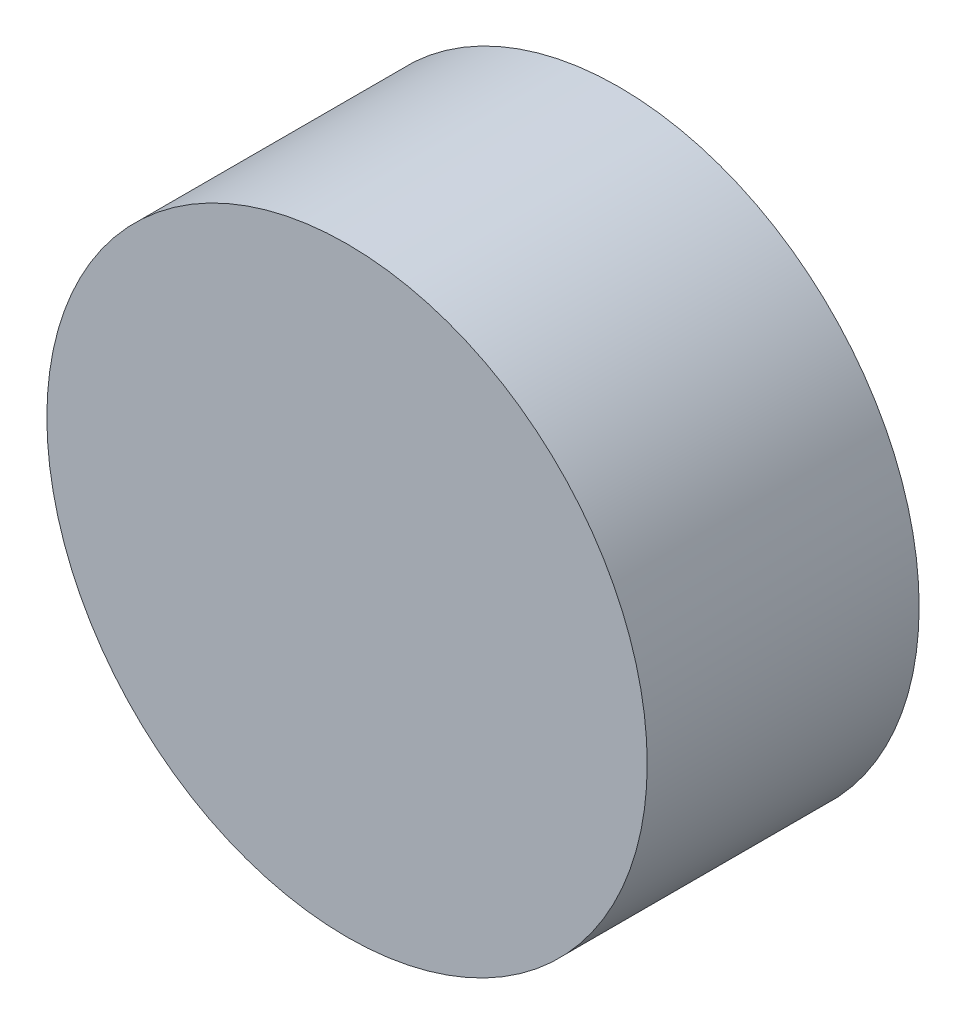
ISO-10303-21;
HEADER;
FILE_DESCRIPTION(('STEP AP214'),'2;1');
FILE_NAME('part.step','',(''),(''),'','','');
FILE_SCHEMA(('AUTOMOTIVE_DESIGN { 1 0 10303 214 1 1 1 1 }'));
ENDSEC;
DATA;
#1=APPLICATION_CONTEXT('core data for automotive mechanical design processes');
#2=APPLICATION_PROTOCOL_DEFINITION('international standard','automotive_design',2000,#1);
#3=PRODUCT_CONTEXT('',#1,'mechanical');
#4=PRODUCT('Part','Part','',(#3));
#5=PRODUCT_RELATED_PRODUCT_CATEGORY('part','',(#4));
#6=PRODUCT_DEFINITION_FORMATION('','',#4);
#7=PRODUCT_DEFINITION_CONTEXT('part definition',#1,'design');
#8=PRODUCT_DEFINITION('design','',#6,#7);
#9=PRODUCT_DEFINITION_SHAPE('','',#8);
#10=(LENGTH_UNIT() NAMED_UNIT(*) SI_UNIT(.MILLI.,.METRE.));
#11=(NAMED_UNIT(*) PLANE_ANGLE_UNIT() SI_UNIT($,.RADIAN.));
#12=(NAMED_UNIT(*) SI_UNIT($,.STERADIAN.) SOLID_ANGLE_UNIT());
#13=UNCERTAINTY_MEASURE_WITH_UNIT(LENGTH_MEASURE(1.E-05),#10,'distance_accuracy_value','');
#14=(GEOMETRIC_REPRESENTATION_CONTEXT(3) GLOBAL_UNCERTAINTY_ASSIGNED_CONTEXT((#13)) GLOBAL_UNIT_ASSIGNED_CONTEXT((#10,
#11,#12)) REPRESENTATION_CONTEXT('',''));
#15=CARTESIAN_POINT('',(0.,0.,0.));
#16=DIRECTION('',(0.,0.,1.));
#17=DIRECTION('',(1.,0.,0.));
#18=AXIS2_PLACEMENT_3D('',#15,#16,#17);
#19=CARTESIAN_POINT('',(0.,0.,15.4));
#20=DIRECTION('',(0.,0.,-1.));
#21=DIRECTION('',(-1.,0.,0.));
#22=AXIS2_PLACEMENT_3D('',#19,#20,#21);
#23=CYLINDRICAL_SURFACE('',#22,17.);
#24=CARTESIAN_POINT('',(0.,0.,15.4));
#25=DIRECTION('',(0.,0.,1.));
#26=DIRECTION('',(1.,0.,0.));
#27=AXIS2_PLACEMENT_3D('',#24,#25,#26);
#28=CIRCLE('',#27,17.);
#29=CARTESIAN_POINT('',(-17.,0.,15.4));
#30=VERTEX_POINT('',#29);
#31=EDGE_CURVE('E10',#30,#30,#28,.T.);
#32=CARTESIAN_POINT('',(0.,0.,0.));
#33=DIRECTION('',(0.,0.,1.));
#34=DIRECTION('',(1.,0.,0.));
#35=AXIS2_PLACEMENT_3D('',#32,#33,#34);
#36=CIRCLE('',#35,17.);
#37=CARTESIAN_POINT('',(-17.,0.,0.));
#38=VERTEX_POINT('',#37);
#39=EDGE_CURVE('E40',#38,#38,#36,.T.);
#40=CARTESIAN_POINT('',(-17.,0.,15.4));
#41=CARTESIAN_POINT('',(-17.,0.,15.2395833333333));
#42=CARTESIAN_POINT('',(-17.,0.,15.0791666666667));
#43=CARTESIAN_POINT('',(-17.,0.,14.7583333333333));
#44=CARTESIAN_POINT('',(-17.,0.,14.5979166666667));
#45=CARTESIAN_POINT('',(-17.,0.,14.2770833333333));
#46=CARTESIAN_POINT('',(-17.,0.,14.1166666666667));
#47=CARTESIAN_POINT('',(-17.,0.,13.7958333333333));
#48=CARTESIAN_POINT('',(-17.,0.,13.6354166666667));
#49=CARTESIAN_POINT('',(-17.,0.,13.3145833333333));
#50=CARTESIAN_POINT('',(-17.,0.,13.1541666666667));
#51=CARTESIAN_POINT('',(-17.,0.,12.8333333333333));
#52=CARTESIAN_POINT('',(-17.,0.,12.6729166666667));
#53=CARTESIAN_POINT('',(-17.,0.,12.3520833333333));
#54=CARTESIAN_POINT('',(-17.,0.,12.1916666666667));
#55=CARTESIAN_POINT('',(-17.,0.,11.8708333333333));
#56=CARTESIAN_POINT('',(-17.,0.,11.7104166666667));
#57=CARTESIAN_POINT('',(-17.,0.,11.3895833333333));
#58=CARTESIAN_POINT('',(-17.,0.,11.2291666666667));
#59=CARTESIAN_POINT('',(-17.,0.,10.9083333333333));
#60=CARTESIAN_POINT('',(-17.,0.,10.7479166666667));
#61=CARTESIAN_POINT('',(-17.,0.,10.4270833333333));
#62=CARTESIAN_POINT('',(-17.,0.,10.2666666666667));
#63=CARTESIAN_POINT('',(-17.,0.,9.94583333333333));
#64=CARTESIAN_POINT('',(-17.,0.,9.78541666666667));
#65=CARTESIAN_POINT('',(-17.,0.,9.46458333333333));
#66=CARTESIAN_POINT('',(-17.,0.,9.30416666666667));
#67=CARTESIAN_POINT('',(-17.,0.,8.98333333333333));
#68=CARTESIAN_POINT('',(-17.,0.,8.82291666666667));
#69=CARTESIAN_POINT('',(-17.,0.,8.50208333333333));
#70=CARTESIAN_POINT('',(-17.,0.,8.34166666666667));
#71=CARTESIAN_POINT('',(-17.,0.,8.02083333333333));
#72=CARTESIAN_POINT('',(-17.,0.,7.86041666666667));
#73=CARTESIAN_POINT('',(-17.,0.,7.53958333333333));
#74=CARTESIAN_POINT('',(-17.,0.,7.37916666666667));
#75=CARTESIAN_POINT('',(-17.,0.,7.05833333333333));
#76=CARTESIAN_POINT('',(-17.,0.,6.89791666666667));
#77=CARTESIAN_POINT('',(-17.,0.,6.57708333333333));
#78=CARTESIAN_POINT('',(-17.,0.,6.41666666666667));
#79=CARTESIAN_POINT('',(-17.,0.,6.09583333333333));
#80=CARTESIAN_POINT('',(-17.,0.,5.93541666666667));
#81=CARTESIAN_POINT('',(-17.,0.,5.61458333333333));
#82=CARTESIAN_POINT('',(-17.,0.,5.45416666666667));
#83=CARTESIAN_POINT('',(-17.,0.,5.13333333333333));
#84=CARTESIAN_POINT('',(-17.,0.,4.97291666666667));
#85=CARTESIAN_POINT('',(-17.,0.,4.65208333333333));
#86=CARTESIAN_POINT('',(-17.,0.,4.49166666666667));
#87=CARTESIAN_POINT('',(-17.,0.,4.17083333333333));
#88=CARTESIAN_POINT('',(-17.,0.,4.01041666666667));
#89=CARTESIAN_POINT('',(-17.,0.,3.68958333333333));
#90=CARTESIAN_POINT('',(-17.,0.,3.52916666666667));
#91=CARTESIAN_POINT('',(-17.,0.,3.20833333333333));
#92=CARTESIAN_POINT('',(-17.,0.,3.04791666666667));
#93=CARTESIAN_POINT('',(-17.,0.,2.72708333333333));
#94=CARTESIAN_POINT('',(-17.,0.,2.56666666666667));
#95=CARTESIAN_POINT('',(-17.,0.,2.24583333333333));
#96=CARTESIAN_POINT('',(-17.,0.,2.08541666666666));
#97=CARTESIAN_POINT('',(-17.,0.,1.76458333333333));
#98=CARTESIAN_POINT('',(-17.,0.,1.60416666666667));
#99=CARTESIAN_POINT('',(-17.,0.,1.28333333333333));
#100=CARTESIAN_POINT('',(-17.,0.,1.12291666666666));
#101=CARTESIAN_POINT('',(-17.,0.,0.802083333333332));
#102=CARTESIAN_POINT('',(-17.,0.,0.641666666666665));
#103=CARTESIAN_POINT('',(-17.,0.,0.320833333333332));
#104=CARTESIAN_POINT('',(-17.,0.,0.160416666666665));
#105=CARTESIAN_POINT('',(-17.,0.,0.));
#106=B_SPLINE_CURVE_WITH_KNOTS('',3,(#40,#41,#42,#43,#44,#45,#46,#47,#48,#49,#50,#51,#52,#53,
#54,#55,#56,#57,#58,#59,#60,#61,#62,#63,#64,#65,#66,#67,#68,#69,#70,#71,#72,#73,#74,#75,#76,#77,
#78,#79,#80,#81,#82,#83,#84,#85,#86,#87,#88,#89,#90,#91,#92,#93,#94,#95,#96,#97,#98,#99,#100,
#101,#102,#103,#104,#105),.UNSPECIFIED.,.F.,.F.,(4,2,2,2,2,2,2,2,2,2,2,2,2,2,2,2,2,2,2,2,2,2,2,
2,2,2,2,2,2,2,2,2,4),(0.,0.481249999999999,0.9625,1.44375,1.925,2.40625,2.8875,3.36875,3.85,
4.33125,4.8125,5.29375,5.775,6.25625,6.7375,7.21875,7.7,8.18125,8.6625,9.14375,9.625,10.10625,
10.5875,11.06875,11.55,12.03125,12.5125,12.99375,13.475,13.95625,14.4375,14.91875,15.4),.UNSPECIFIED.);
#107=EDGE_CURVE('BSEAM37',#30,#38,#106,.T.);
#108=ORIENTED_EDGE('',*,*,#31,.F.);
#109=ORIENTED_EDGE('',*,*,#39,.T.);
#110=ORIENTED_EDGE('',*,*,#107,.T.);
#111=ORIENTED_EDGE('',*,*,#107,.F.);
#112=EDGE_LOOP('',(#108,#110,#109,#111));
#113=FACE_BOUND('',#112,.T.);
#114=ADVANCED_FACE('F37',(#113),#23,.T.);
#115=CARTESIAN_POINT('',(0.,0.,15.4));
#116=DIRECTION('',(0.,0.,1.));
#117=DIRECTION('',(1.,0.,0.));
#118=AXIS2_PLACEMENT_3D('',#115,#116,#117);
#119=PLANE('',#118);
#120=ORIENTED_EDGE('',*,*,#31,.T.);
#121=EDGE_LOOP('',(#120));
#122=FACE_BOUND('',#121,.T.);
#123=ADVANCED_FACE('F54',(#122),#119,.T.);
#124=CARTESIAN_POINT('',(0.,0.,0.));
#125=DIRECTION('',(0.,0.,1.));
#126=DIRECTION('',(1.,0.,0.));
#127=AXIS2_PLACEMENT_3D('',#124,#125,#126);
#128=PLANE('',#127);
#129=ORIENTED_EDGE('',*,*,#39,.F.);
#130=EDGE_LOOP('',(#129));
#131=FACE_BOUND('',#130,.T.);
#132=ADVANCED_FACE('F52',(#131),#128,.F.);
#133=CLOSED_SHELL('',(#114,#123,#132));
#134=MANIFOLD_SOLID_BREP('B2',#133);
#135=ADVANCED_BREP_SHAPE_REPRESENTATION('',(#18,#134),#14);
#136=SHAPE_DEFINITION_REPRESENTATION(#9,#135);
ENDSEC;
END-ISO-10303-21;
